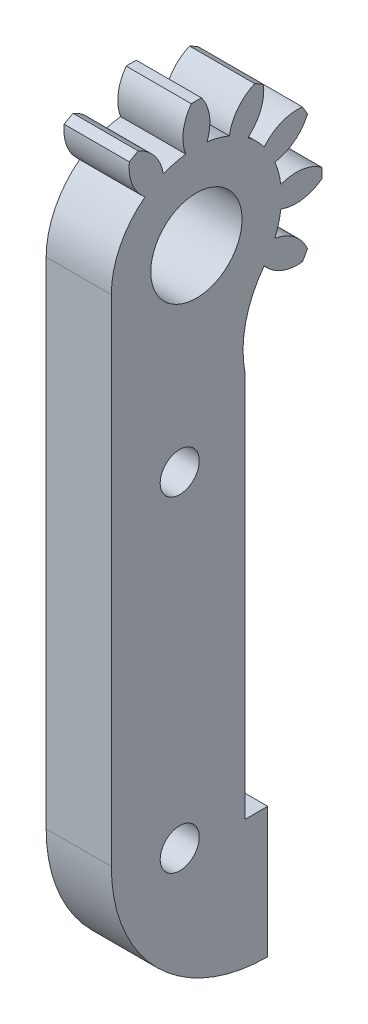
ISO-10303-21;
HEADER;
FILE_DESCRIPTION(('STEP AP214'),'2;1');
FILE_NAME('part.step','',(''),(''),'','','');
FILE_SCHEMA(('AUTOMOTIVE_DESIGN { 1 0 10303 214 1 1 1 1 }'));
ENDSEC;
DATA;
#1=APPLICATION_CONTEXT('core data for automotive mechanical design processes');
#2=APPLICATION_PROTOCOL_DEFINITION('international standard','automotive_design',2000,#1);
#3=PRODUCT_CONTEXT('',#1,'mechanical');
#4=PRODUCT('Part','Part','',(#3));
#5=PRODUCT_RELATED_PRODUCT_CATEGORY('part','',(#4));
#6=PRODUCT_DEFINITION_FORMATION('','',#4);
#7=PRODUCT_DEFINITION_CONTEXT('part definition',#1,'design');
#8=PRODUCT_DEFINITION('design','',#6,#7);
#9=PRODUCT_DEFINITION_SHAPE('','',#8);
#10=(LENGTH_UNIT() NAMED_UNIT(*) SI_UNIT(.MILLI.,.METRE.));
#11=(NAMED_UNIT(*) PLANE_ANGLE_UNIT() SI_UNIT($,.RADIAN.));
#12=(NAMED_UNIT(*) SI_UNIT($,.STERADIAN.) SOLID_ANGLE_UNIT());
#13=UNCERTAINTY_MEASURE_WITH_UNIT(LENGTH_MEASURE(1.E-05),#10,'distance_accuracy_value','');
#14=(GEOMETRIC_REPRESENTATION_CONTEXT(3) GLOBAL_UNCERTAINTY_ASSIGNED_CONTEXT((#13)) GLOBAL_UNIT_ASSIGNED_CONTEXT((#10,
#11,#12)) REPRESENTATION_CONTEXT('',''));
#15=CARTESIAN_POINT('',(0.,0.,0.));
#16=DIRECTION('',(0.,0.,1.));
#17=DIRECTION('',(1.,0.,0.));
#18=AXIS2_PLACEMENT_3D('',#15,#16,#17);
#19=CARTESIAN_POINT('',(5.,0.,0.));
#20=DIRECTION('',(-1.,0.,0.));
#21=DIRECTION('',(0.,-0.258819045102521,0.965925826289068));
#22=AXIS2_PLACEMENT_3D('',#19,#20,#21);
#23=CYLINDRICAL_SURFACE('',#22,6.53025);
#24=CARTESIAN_POINT('',(0.,0.,0.));
#25=DIRECTION('',(-1.,0.,0.));
#26=DIRECTION('',(0.,0.707106781186549,-0.707106781186546));
#27=AXIS2_PLACEMENT_3D('',#24,#25,#26);
#28=CIRCLE('',#27,6.53025);
#29=CARTESIAN_POINT('',(0.,0.,6.53025));
#30=VERTEX_POINT('',#29);
#31=CARTESIAN_POINT('',(0.,5.20307403430746,3.94616087558724));
#32=VERTEX_POINT('',#31);
#33=EDGE_CURVE('E251',#30,#32,#28,.T.);
#34=ORIENTED_EDGE('',*,*,#33,.F.);
#35=DIRECTION('',(1.,0.,0.));
#36=VECTOR('',#35,1.);
#37=CARTESIAN_POINT('',(-51.4198405287297,0.,6.53025));
#38=LINE('',#37,#36);
#39=CARTESIAN_POINT('',(5.,0.,6.53025));
#40=VERTEX_POINT('',#39);
#41=EDGE_CURVE('E236',#30,#40,#38,.T.);
#42=ORIENTED_EDGE('',*,*,#41,.T.);
#43=CARTESIAN_POINT('',(5.,0.,0.));
#44=DIRECTION('',(-1.,0.,0.));
#45=DIRECTION('',(0.,0.707106781186549,-0.707106781186546));
#46=AXIS2_PLACEMENT_3D('',#43,#44,#45);
#47=CIRCLE('',#46,6.53025);
#48=CARTESIAN_POINT('',(5.,5.20307403430746,3.94616087558724));
#49=VERTEX_POINT('',#48);
#50=EDGE_CURVE('E249',#40,#49,#47,.T.);
#51=ORIENTED_EDGE('',*,*,#50,.T.);
#52=DIRECTION('',(-1.,0.,0.));
#53=VECTOR('',#52,1.);
#54=CARTESIAN_POINT('',(5.,5.20307403430746,3.94616087558724));
#55=LINE('',#54,#53);
#56=EDGE_CURVE('E258',#49,#32,#55,.T.);
#57=ORIENTED_EDGE('',*,*,#56,.T.);
#58=EDGE_LOOP('',(#34,#42,#51,#57));
#59=FACE_BOUND('',#58,.T.);
#60=ADVANCED_FACE('F33',(#59),#23,.T.);
#61=CARTESIAN_POINT('',(5.,0.,0.));
#62=DIRECTION('',(-1.,0.,0.));
#63=DIRECTION('',(0.,-0.258819045102521,0.965925826289068));
#64=AXIS2_PLACEMENT_3D('',#61,#62,#63);
#65=PLANE('',#64);
#66=CARTESIAN_POINT('',(5.,-39.4107973671098,1.28024999999994));
#67=DIRECTION('',(-1.,0.,0.));
#68=DIRECTION('',(0.,0.,1.));
#69=AXIS2_PLACEMENT_3D('',#66,#67,#68);
#70=CIRCLE('',#69,1.50000000000004);
#71=CARTESIAN_POINT('',(5.,-39.4107973671098,2.78024999999999));
#72=VERTEX_POINT('',#71);
#73=EDGE_CURVE('E561',#72,#72,#70,.T.);
#74=ORIENTED_EDGE('',*,*,#73,.T.);
#75=EDGE_LOOP('',(#74));
#76=FACE_BOUND('',#75,.T.);
#77=CARTESIAN_POINT('',(5.,-14.4107973671098,1.28024999999996));
#78=DIRECTION('',(-1.,0.,0.));
#79=DIRECTION('',(0.,0.,1.));
#80=AXIS2_PLACEMENT_3D('',#77,#78,#79);
#81=CIRCLE('',#80,1.50000000000004);
#82=CARTESIAN_POINT('',(5.,-14.4107973671098,2.78025));
#83=VERTEX_POINT('',#82);
#84=EDGE_CURVE('E245',#83,#83,#81,.T.);
#85=ORIENTED_EDGE('',*,*,#84,.T.);
#86=EDGE_LOOP('',(#85));
#87=FACE_BOUND('',#86,.T.);
#88=ORIENTED_EDGE('',*,*,#50,.F.);
#89=DIRECTION('',(0.,-1.,0.));
#90=VECTOR('',#89,1.);
#91=CARTESIAN_POINT('',(5.,0.,6.53025));
#92=LINE('',#91,#90);
#93=CARTESIAN_POINT('',(5.,-38.,6.53024999999999));
#94=VERTEX_POINT('',#93);
#95=EDGE_CURVE('E232',#40,#94,#92,.T.);
#96=ORIENTED_EDGE('',*,*,#95,.T.);
#97=CARTESIAN_POINT('',(5.,-38.,-5.46975));
#98=DIRECTION('',(1.,0.,0.));
#99=DIRECTION('',(0.,0.,-1.));
#100=AXIS2_PLACEMENT_3D('',#97,#98,#99);
#101=CIRCLE('',#100,12.);
#102=CARTESIAN_POINT('',(5.,-50.,-5.46975000000001));
#103=VERTEX_POINT('',#102);
#104=EDGE_CURVE('E244',#94,#103,#101,.T.);
#105=ORIENTED_EDGE('',*,*,#104,.T.);
#106=DIRECTION('',(0.,1.,0.));
#107=VECTOR('',#106,1.);
#108=CARTESIAN_POINT('',(5.,-50.,-5.46975000000001));
#109=LINE('',#108,#107);
#110=CARTESIAN_POINT('',(5.,-40.,-5.46975));
#111=VERTEX_POINT('',#110);
#112=EDGE_CURVE('E578',#103,#111,#109,.T.);
#113=ORIENTED_EDGE('',*,*,#112,.T.);
#114=DIRECTION('',(0.,0.,1.));
#115=VECTOR('',#114,1.);
#116=CARTESIAN_POINT('',(5.,-40.,-5.46975));
#117=LINE('',#116,#115);
#118=CARTESIAN_POINT('',(5.,-40.,-3.71975000000001));
#119=VERTEX_POINT('',#118);
#120=EDGE_CURVE('E409',#111,#119,#117,.T.);
#121=ORIENTED_EDGE('',*,*,#120,.T.);
#122=DIRECTION('',(0.,1.,0.));
#123=VECTOR('',#122,1.);
#124=CARTESIAN_POINT('',(5.,-40.,-3.71975000000001));
#125=LINE('',#124,#123);
#126=CARTESIAN_POINT('',(5.,-10.2840002724986,-3.71975));
#127=VERTEX_POINT('',#126);
#128=EDGE_CURVE('E405',#119,#127,#125,.T.);
#129=ORIENTED_EDGE('',*,*,#128,.T.);
#130=CARTESIAN_POINT('',(5.,-8.78047610160418,-11.5771932907617));
#131=DIRECTION('',(-1.,0.,0.));
#132=DIRECTION('',(0.,0.,-1.));
#133=AXIS2_PLACEMENT_3D('',#130,#131,#132);
#134=CIRCLE('',#133,8.);
#135=CARTESIAN_POINT('',(5.,-3.94616087558718,-5.20307403430751));
#136=VERTEX_POINT('',#135);
#137=EDGE_CURVE('E252',#127,#136,#134,.T.);
#138=ORIENTED_EDGE('',*,*,#137,.T.);
#139=CARTESIAN_POINT('',(5.,-1.86722961459182,-7.76589373379014));
#140=DIRECTION('',(-1.,0.,0.));
#141=DIRECTION('',(0.,-0.707106781186554,0.707106781186541));
#142=AXIS2_PLACEMENT_3D('',#139,#140,#141);
#143=CIRCLE('',#142,3.3);
#144=CARTESIAN_POINT('',(5.,-5.14670283362097,-8.13339258504087));
#145=VERTEX_POINT('',#144);
#146=EDGE_CURVE('E384',#145,#136,#143,.T.);
#147=ORIENTED_EDGE('',*,*,#146,.F.);
#148=CARTESIAN_POINT('',(5.,0.,0.));
#149=DIRECTION('',(-1.,0.,0.));
#150=DIRECTION('',(0.,-0.258819045102521,0.965925826289068));
#151=AXIS2_PLACEMENT_3D('',#148,#149,#150);
#152=CIRCLE('',#151,9.625);
#153=CARTESIAN_POINT('',(5.,-4.47037318078674,-8.52387169216564));
#154=VERTEX_POINT('',#153);
#155=EDGE_CURVE('E400',#154,#145,#152,.T.);
#156=ORIENTED_EDGE('',*,*,#155,.F.);
#157=CARTESIAN_POINT('',(5.,-5.79184644925663,-5.50001514783032));
#158=DIRECTION('',(-1.,0.,0.));
#159=DIRECTION('',(0.,-0.965925826289071,0.258819045102511));
#160=AXIS2_PLACEMENT_3D('',#157,#158,#159);
#161=CIRCLE('',#160,3.3);
#162=CARTESIAN_POINT('',(5.,-2.53291385368778,-6.01901258283254));
#163=VERTEX_POINT('',#162);
#164=EDGE_CURVE('E363',#163,#154,#161,.T.);
#165=ORIENTED_EDGE('',*,*,#164,.F.);
#166=CARTESIAN_POINT('',(5.,0.,0.));
#167=DIRECTION('',(-1.,0.,0.));
#168=DIRECTION('',(0.,-0.965925826289071,0.258819045102511));
#169=AXIS2_PLACEMENT_3D('',#166,#167,#168);
#170=CIRCLE('',#169,6.53025);
#171=CARTESIAN_POINT('',(5.,-0.815938548524983,-6.47907472927508));
#172=VERTEX_POINT('',#171);
#173=EDGE_CURVE('E368',#172,#163,#170,.T.);
#174=ORIENTED_EDGE('',*,*,#173,.F.);
#175=CARTESIAN_POINT('',(5.,2.26587858595993,-7.65907606384855));
#176=DIRECTION('',(-1.,0.,0.));
#177=DIRECTION('',(0.,-0.965925826289071,0.258819045102511));
#178=AXIS2_PLACEMENT_3D('',#175,#176,#177);
#179=CIRCLE('',#178,3.3);
#180=CARTESIAN_POINT('',(5.,-0.390479107124668,-9.61707601440787));
#181=VERTEX_POINT('',#180);
#182=EDGE_CURVE('E365',#181,#172,#179,.T.);
#183=ORIENTED_EDGE('',*,*,#182,.F.);
#184=CARTESIAN_POINT('',(5.,0.390479107124869,-9.61707601440786));
#185=VERTEX_POINT('',#184);
#186=EDGE_CURVE('E485',#185,#181,#152,.T.);
#187=ORIENTED_EDGE('',*,*,#186,.F.);
#188=CARTESIAN_POINT('',(5.,-2.26587858595977,-7.6590760638486));
#189=DIRECTION('',(-1.,0.,0.));
#190=DIRECTION('',(0.,-0.965925826289065,-0.258819045102531));
#191=AXIS2_PLACEMENT_3D('',#188,#189,#190);
#192=CIRCLE('',#191,3.3);
#193=CARTESIAN_POINT('',(5.,0.81593854852512,-6.47907472927506));
#194=VERTEX_POINT('',#193);
#195=EDGE_CURVE('E341',#194,#185,#192,.T.);
#196=ORIENTED_EDGE('',*,*,#195,.F.);
#197=CARTESIAN_POINT('',(5.,0.,0.));
#198=DIRECTION('',(-1.,0.,0.));
#199=DIRECTION('',(0.,-0.965925826289065,-0.258819045102531));
#200=AXIS2_PLACEMENT_3D('',#197,#198,#199);
#201=CIRCLE('',#200,6.53025);
#202=CARTESIAN_POINT('',(5.,2.53291385368791,-6.01901258283249));
#203=VERTEX_POINT('',#202);
#204=EDGE_CURVE('E346',#203,#194,#201,.T.);
#205=ORIENTED_EDGE('',*,*,#204,.F.);
#206=CARTESIAN_POINT('',(5.,5.79184644925675,-5.5000151478302));
#207=DIRECTION('',(-1.,0.,0.));
#208=DIRECTION('',(0.,-0.965925826289065,-0.258819045102531));
#209=AXIS2_PLACEMENT_3D('',#206,#207,#208);
#210=CIRCLE('',#209,3.3);
#211=CARTESIAN_POINT('',(5.,4.47037318078691,-8.52387169216554));
#212=VERTEX_POINT('',#211);
#213=EDGE_CURVE('E343',#212,#203,#210,.T.);
#214=ORIENTED_EDGE('',*,*,#213,.F.);
#215=CARTESIAN_POINT('',(5.,5.14670283362114,-8.13339258504076));
#216=VERTEX_POINT('',#215);
#217=EDGE_CURVE('E487',#216,#212,#152,.T.);
#218=ORIENTED_EDGE('',*,*,#217,.F.);
#219=CARTESIAN_POINT('',(5.,1.86722961459199,-7.7658937337901));
#220=DIRECTION('',(-1.,0.,0.));
#221=DIRECTION('',(0.,-0.707106781186539,-0.707106781186556));
#222=AXIS2_PLACEMENT_3D('',#219,#220,#221);
#223=CIRCLE('',#222,3.3);
#224=CARTESIAN_POINT('',(5.,3.94616087558729,-5.20307403430742));
#225=VERTEX_POINT('',#224);
#226=EDGE_CURVE('E447',#225,#216,#223,.T.);
#227=ORIENTED_EDGE('',*,*,#226,.F.);
#228=CARTESIAN_POINT('',(5.,0.,0.));
#229=DIRECTION('',(-1.,0.,0.));
#230=DIRECTION('',(0.,-0.707106781186539,-0.707106781186556));
#231=AXIS2_PLACEMENT_3D('',#228,#229,#230);
#232=CIRCLE('',#231,6.53025);
#233=CARTESIAN_POINT('',(5.,5.20307403430752,-3.94616087558716));
#234=VERTEX_POINT('',#233);
#235=EDGE_CURVE('E452',#234,#225,#232,.T.);
#236=ORIENTED_EDGE('',*,*,#235,.F.);
#237=CARTESIAN_POINT('',(5.,7.76589373379014,-1.8672296145918));
#238=DIRECTION('',(-1.,0.,0.));
#239=DIRECTION('',(0.,-0.707106781186539,-0.707106781186556));
#240=AXIS2_PLACEMENT_3D('',#237,#238,#239);
#241=CIRCLE('',#240,3.3);
#242=CARTESIAN_POINT('',(5.,8.13339258504089,-5.14670283362094));
#243=VERTEX_POINT('',#242);
#244=EDGE_CURVE('E449',#243,#234,#241,.T.);
#245=ORIENTED_EDGE('',*,*,#244,.F.);
#246=CARTESIAN_POINT('',(5.,8.52387169216565,-4.47037318078671));
#247=VERTEX_POINT('',#246);
#248=EDGE_CURVE('E303',#247,#243,#152,.T.);
#249=ORIENTED_EDGE('',*,*,#248,.F.);
#250=CARTESIAN_POINT('',(5.,5.50001514783034,-5.79184644925661));
#251=DIRECTION('',(-1.,0.,0.));
#252=DIRECTION('',(0.,-0.258819045102508,-0.965925826289072));
#253=AXIS2_PLACEMENT_3D('',#250,#251,#252);
#254=CIRCLE('',#253,3.3);
#255=CARTESIAN_POINT('',(5.,6.01901258283255,-2.53291385368776));
#256=VERTEX_POINT('',#255);
#257=EDGE_CURVE('E429',#256,#247,#254,.T.);
#258=ORIENTED_EDGE('',*,*,#257,.F.);
#259=CARTESIAN_POINT('',(5.,0.,0.));
#260=DIRECTION('',(-1.,0.,0.));
#261=DIRECTION('',(0.,-0.258819045102508,-0.965925826289072));
#262=AXIS2_PLACEMENT_3D('',#259,#260,#261);
#263=CIRCLE('',#262,6.53025);
#264=CARTESIAN_POINT('',(5.,6.47907472927508,-0.81593854852496));
#265=VERTEX_POINT('',#264);
#266=EDGE_CURVE('E434',#265,#256,#263,.T.);
#267=ORIENTED_EDGE('',*,*,#266,.F.);
#268=CARTESIAN_POINT('',(5.,7.65907606384855,2.26587858595996));
#269=DIRECTION('',(-1.,0.,0.));
#270=DIRECTION('',(0.,-0.258819045102508,-0.965925826289072));
#271=AXIS2_PLACEMENT_3D('',#268,#269,#270);
#272=CIRCLE('',#271,3.3);
#273=CARTESIAN_POINT('',(5.,9.61707601440787,-0.390479107124634));
#274=VERTEX_POINT('',#273);
#275=EDGE_CURVE('E431',#274,#265,#272,.T.);
#276=ORIENTED_EDGE('',*,*,#275,.F.);
#277=CARTESIAN_POINT('',(5.,9.61707601440786,0.390479107124769));
#278=VERTEX_POINT('',#277);
#279=EDGE_CURVE('E299',#278,#274,#152,.T.);
#280=ORIENTED_EDGE('',*,*,#279,.F.);
#281=CARTESIAN_POINT('',(5.,7.65907606384858,-2.26587858595985));
#282=DIRECTION('',(-1.,0.,0.));
#283=DIRECTION('',(0.,0.258819045102521,-0.965925826289068));
#284=AXIS2_PLACEMENT_3D('',#281,#282,#283);
#285=CIRCLE('',#284,3.3);
#286=CARTESIAN_POINT('',(5.,6.47907472927507,0.815938548525052));
#287=VERTEX_POINT('',#286);
#288=EDGE_CURVE('E272',#287,#278,#285,.T.);
#289=ORIENTED_EDGE('',*,*,#288,.F.);
#290=CARTESIAN_POINT('',(5.,0.,0.));
#291=DIRECTION('',(-1.,0.,0.));
#292=DIRECTION('',(0.,0.258819045102521,-0.965925826289068));
#293=AXIS2_PLACEMENT_3D('',#290,#291,#292);
#294=CIRCLE('',#293,6.53025);
#295=CARTESIAN_POINT('',(5.,6.01901258283252,2.53291385368785));
#296=VERTEX_POINT('',#295);
#297=EDGE_CURVE('E277',#296,#287,#294,.T.);
#298=ORIENTED_EDGE('',*,*,#297,.F.);
#299=CARTESIAN_POINT('',(5.,5.50001514783026,5.79184644925669));
#300=DIRECTION('',(-1.,0.,0.));
#301=DIRECTION('',(0.,0.258819045102521,-0.965925826289068));
#302=AXIS2_PLACEMENT_3D('',#299,#300,#301);
#303=CIRCLE('',#302,3.3);
#304=CARTESIAN_POINT('',(5.,8.52387169216559,4.47037318078683));
#305=VERTEX_POINT('',#304);
#306=EDGE_CURVE('E274',#305,#296,#303,.T.);
#307=ORIENTED_EDGE('',*,*,#306,.F.);
#308=CARTESIAN_POINT('',(5.,8.13339258504082,5.14670283362106));
#309=VERTEX_POINT('',#308);
#310=EDGE_CURVE('E297',#309,#305,#152,.T.);
#311=ORIENTED_EDGE('',*,*,#310,.F.);
#312=CARTESIAN_POINT('',(5.,7.76589373379012,1.86722961459191));
#313=DIRECTION('',(-1.,0.,0.));
#314=DIRECTION('',(0.,0.707106781186549,-0.707106781186546));
#315=AXIS2_PLACEMENT_3D('',#312,#313,#314);
#316=CIRCLE('',#315,3.3);
#317=EDGE_CURVE('E257',#49,#309,#316,.T.);
#318=ORIENTED_EDGE('',*,*,#317,.F.);
#319=EDGE_LOOP('',(#88,#96,#105,#113,#121,#129,#138,#147,#156,#165,#174,#183,#187,#196,#205,
#214,#218,#227,#236,#245,#249,#258,#267,#276,#280,#289,#298,#307,#311,#318));
#320=FACE_BOUND('',#319,.T.);
#321=CARTESIAN_POINT('',(5.,0.,0.));
#322=DIRECTION('',(-1.,0.,0.));
#323=DIRECTION('',(0.,-0.258819045102521,0.965925826289068));
#324=AXIS2_PLACEMENT_3D('',#321,#322,#323);
#325=CIRCLE('',#324,3.5);
#326=CARTESIAN_POINT('',(5.,-0.905866657858825,3.38074039201174));
#327=VERTEX_POINT('',#326);
#328=EDGE_CURVE('E426',#327,#327,#325,.F.);
#329=ORIENTED_EDGE('',*,*,#328,.F.);
#330=EDGE_LOOP('',(#329));
#331=FACE_BOUND('',#330,.T.);
#332=ADVANCED_FACE('F35',(#76,#87,#320,#331),#65,.F.);
#333=CARTESIAN_POINT('',(0.,0.,0.));
#334=DIRECTION('',(1.,0.,0.));
#335=DIRECTION('',(0.,0.258819045102521,-0.965925826289068));
#336=AXIS2_PLACEMENT_3D('',#333,#334,#335);
#337=PLANE('',#336);
#338=CARTESIAN_POINT('',(0.,-39.4107973671098,1.28024999999994));
#339=DIRECTION('',(-1.,0.,0.));
#340=DIRECTION('',(0.,0.,1.));
#341=AXIS2_PLACEMENT_3D('',#338,#339,#340);
#342=CIRCLE('',#341,1.50000000000004);
#343=CARTESIAN_POINT('',(0.,-39.4107973671098,2.78024999999999));
#344=VERTEX_POINT('',#343);
#345=EDGE_CURVE('E556',#344,#344,#342,.T.);
#346=ORIENTED_EDGE('',*,*,#345,.F.);
#347=EDGE_LOOP('',(#346));
#348=FACE_BOUND('',#347,.T.);
#349=CARTESIAN_POINT('',(0.,-14.4107973671098,1.28024999999996));
#350=DIRECTION('',(-1.,0.,0.));
#351=DIRECTION('',(0.,0.,1.));
#352=AXIS2_PLACEMENT_3D('',#349,#350,#351);
#353=CIRCLE('',#352,1.50000000000004);
#354=CARTESIAN_POINT('',(0.,-14.4107973671098,2.78025));
#355=VERTEX_POINT('',#354);
#356=EDGE_CURVE('E559',#355,#355,#353,.T.);
#357=ORIENTED_EDGE('',*,*,#356,.F.);
#358=EDGE_LOOP('',(#357));
#359=FACE_BOUND('',#358,.T.);
#360=CARTESIAN_POINT('',(0.,-1.86722961459182,-7.76589373379014));
#361=DIRECTION('',(1.,0.,0.));
#362=DIRECTION('',(0.,0.258819045102521,-0.965925826289068));
#363=AXIS2_PLACEMENT_3D('',#360,#361,#362);
#364=CIRCLE('',#363,3.3);
#365=CARTESIAN_POINT('',(0.,-3.94616087558718,-5.20307403430751));
#366=VERTEX_POINT('',#365);
#367=CARTESIAN_POINT('',(0.,-5.14670283362097,-8.13339258504087));
#368=VERTEX_POINT('',#367);
#369=EDGE_CURVE('E306',#366,#368,#364,.T.);
#370=ORIENTED_EDGE('',*,*,#369,.F.);
#371=CARTESIAN_POINT('',(0.,-8.78047610160418,-11.5771932907617));
#372=DIRECTION('',(1.,0.,0.));
#373=DIRECTION('',(0.,0.,-1.));
#374=AXIS2_PLACEMENT_3D('',#371,#372,#373);
#375=CIRCLE('',#374,8.);
#376=CARTESIAN_POINT('',(0.,-10.2840002724986,-3.71975));
#377=VERTEX_POINT('',#376);
#378=EDGE_CURVE('E425',#366,#377,#375,.T.);
#379=ORIENTED_EDGE('',*,*,#378,.T.);
#380=DIRECTION('',(0.,-1.,0.));
#381=VECTOR('',#380,1.);
#382=CARTESIAN_POINT('',(0.,-40.,-3.71975000000001));
#383=LINE('',#382,#381);
#384=CARTESIAN_POINT('',(0.,-40.,-3.71975000000001));
#385=VERTEX_POINT('',#384);
#386=EDGE_CURVE('E574',#377,#385,#383,.T.);
#387=ORIENTED_EDGE('',*,*,#386,.T.);
#388=DIRECTION('',(0.,0.,-1.));
#389=VECTOR('',#388,1.);
#390=CARTESIAN_POINT('',(0.,-40.,-5.46975));
#391=LINE('',#390,#389);
#392=CARTESIAN_POINT('',(0.,-40.,-5.46975));
#393=VERTEX_POINT('',#392);
#394=EDGE_CURVE('E572',#385,#393,#391,.T.);
#395=ORIENTED_EDGE('',*,*,#394,.T.);
#396=DIRECTION('',(0.,-1.,0.));
#397=VECTOR('',#396,1.);
#398=CARTESIAN_POINT('',(0.,-50.,-5.46975000000001));
#399=LINE('',#398,#397);
#400=CARTESIAN_POINT('',(0.,-50.,-5.46975000000001));
#401=VERTEX_POINT('',#400);
#402=EDGE_CURVE('E570',#393,#401,#399,.T.);
#403=ORIENTED_EDGE('',*,*,#402,.T.);
#404=CARTESIAN_POINT('',(0.,-38.,-5.46975));
#405=DIRECTION('',(1.,0.,0.));
#406=DIRECTION('',(0.,0.,-1.));
#407=AXIS2_PLACEMENT_3D('',#404,#405,#406);
#408=CIRCLE('',#407,12.);
#409=CARTESIAN_POINT('',(0.,-38.,6.53024999999999));
#410=VERTEX_POINT('',#409);
#411=EDGE_CURVE('E415',#401,#410,#408,.F.);
#412=ORIENTED_EDGE('',*,*,#411,.T.);
#413=DIRECTION('',(0.,1.,0.));
#414=VECTOR('',#413,1.);
#415=CARTESIAN_POINT('',(0.,0.,6.53025));
#416=LINE('',#415,#414);
#417=EDGE_CURVE('E423',#410,#30,#416,.T.);
#418=ORIENTED_EDGE('',*,*,#417,.T.);
#419=ORIENTED_EDGE('',*,*,#33,.T.);
#420=CARTESIAN_POINT('',(0.,7.76589373379012,1.86722961459191));
#421=DIRECTION('',(-1.,0.,0.));
#422=DIRECTION('',(0.,0.707106781186549,-0.707106781186546));
#423=AXIS2_PLACEMENT_3D('',#420,#421,#422);
#424=CIRCLE('',#423,3.3);
#425=CARTESIAN_POINT('',(0.,8.13339258504082,5.14670283362106));
#426=VERTEX_POINT('',#425);
#427=EDGE_CURVE('E265',#32,#426,#424,.T.);
#428=ORIENTED_EDGE('',*,*,#427,.T.);
#429=CARTESIAN_POINT('',(0.,0.,0.));
#430=DIRECTION('',(-1.,0.,0.));
#431=DIRECTION('',(0.,-0.258819045102521,0.965925826289068));
#432=AXIS2_PLACEMENT_3D('',#429,#430,#431);
#433=CIRCLE('',#432,9.625);
#434=CARTESIAN_POINT('',(0.,8.52387169216559,4.47037318078683));
#435=VERTEX_POINT('',#434);
#436=EDGE_CURVE('E293',#426,#435,#433,.T.);
#437=ORIENTED_EDGE('',*,*,#436,.T.);
#438=CARTESIAN_POINT('',(0.,5.50001514783026,5.79184644925669));
#439=DIRECTION('',(1.,0.,0.));
#440=DIRECTION('',(0.,0.258819045102521,-0.965925826289068));
#441=AXIS2_PLACEMENT_3D('',#438,#439,#440);
#442=CIRCLE('',#441,3.3);
#443=CARTESIAN_POINT('',(0.,6.01901258283252,2.53291385368785));
#444=VERTEX_POINT('',#443);
#445=EDGE_CURVE('E302',#444,#435,#442,.T.);
#446=ORIENTED_EDGE('',*,*,#445,.F.);
#447=CARTESIAN_POINT('',(0.,0.,0.));
#448=DIRECTION('',(-1.,0.,0.));
#449=DIRECTION('',(0.,0.258819045102521,-0.965925826289068));
#450=AXIS2_PLACEMENT_3D('',#447,#448,#449);
#451=CIRCLE('',#450,6.53025);
#452=CARTESIAN_POINT('',(0.,6.47907472927507,0.815938548525052));
#453=VERTEX_POINT('',#452);
#454=EDGE_CURVE('E275',#444,#453,#451,.T.);
#455=ORIENTED_EDGE('',*,*,#454,.T.);
#456=CARTESIAN_POINT('',(0.,7.65907606384858,-2.26587858595985));
#457=DIRECTION('',(-1.,0.,0.));
#458=DIRECTION('',(0.,0.258819045102521,-0.965925826289068));
#459=AXIS2_PLACEMENT_3D('',#456,#457,#458);
#460=CIRCLE('',#459,3.3);
#461=CARTESIAN_POINT('',(0.,9.61707601440786,0.390479107124768));
#462=VERTEX_POINT('',#461);
#463=EDGE_CURVE('E271',#453,#462,#460,.T.);
#464=ORIENTED_EDGE('',*,*,#463,.T.);
#465=CARTESIAN_POINT('',(0.,9.61707601440787,-0.390479107124634));
#466=VERTEX_POINT('',#465);
#467=EDGE_CURVE('E294',#462,#466,#433,.T.);
#468=ORIENTED_EDGE('',*,*,#467,.T.);
#469=CARTESIAN_POINT('',(0.,7.65907606384855,2.26587858595996));
#470=DIRECTION('',(1.,0.,0.));
#471=DIRECTION('',(0.,0.258819045102521,-0.965925826289068));
#472=AXIS2_PLACEMENT_3D('',#469,#470,#471);
#473=CIRCLE('',#472,3.3);
#474=CARTESIAN_POINT('',(0.,6.47907472927508,-0.81593854852496));
#475=VERTEX_POINT('',#474);
#476=EDGE_CURVE('E11',#475,#466,#473,.T.);
#477=ORIENTED_EDGE('',*,*,#476,.F.);
#478=CARTESIAN_POINT('',(0.,0.,0.));
#479=DIRECTION('',(-1.,0.,0.));
#480=DIRECTION('',(0.,-0.258819045102508,-0.965925826289072));
#481=AXIS2_PLACEMENT_3D('',#478,#479,#480);
#482=CIRCLE('',#481,6.53025);
#483=CARTESIAN_POINT('',(0.,6.01901258283255,-2.53291385368776));
#484=VERTEX_POINT('',#483);
#485=EDGE_CURVE('E432',#475,#484,#482,.T.);
#486=ORIENTED_EDGE('',*,*,#485,.T.);
#487=CARTESIAN_POINT('',(0.,5.50001514783034,-5.79184644925661));
#488=DIRECTION('',(-1.,0.,0.));
#489=DIRECTION('',(0.,-0.258819045102508,-0.965925826289072));
#490=AXIS2_PLACEMENT_3D('',#487,#488,#489);
#491=CIRCLE('',#490,3.3);
#492=CARTESIAN_POINT('',(0.,8.52387169216565,-4.47037318078671));
#493=VERTEX_POINT('',#492);
#494=EDGE_CURVE('E49',#484,#493,#491,.T.);
#495=ORIENTED_EDGE('',*,*,#494,.T.);
#496=CARTESIAN_POINT('',(0.,8.13339258504089,-5.14670283362094));
#497=VERTEX_POINT('',#496);
#498=EDGE_CURVE('E298',#493,#497,#433,.T.);
#499=ORIENTED_EDGE('',*,*,#498,.T.);
#500=CARTESIAN_POINT('',(0.,7.76589373379014,-1.8672296145918));
#501=DIRECTION('',(1.,0.,0.));
#502=DIRECTION('',(0.,0.258819045102521,-0.965925826289068));
#503=AXIS2_PLACEMENT_3D('',#500,#501,#502);
#504=CIRCLE('',#503,3.3);
#505=CARTESIAN_POINT('',(0.,5.20307403430752,-3.94616087558716));
#506=VERTEX_POINT('',#505);
#507=EDGE_CURVE('E42',#506,#497,#504,.T.);
#508=ORIENTED_EDGE('',*,*,#507,.F.);
#509=CARTESIAN_POINT('',(0.,0.,0.));
#510=DIRECTION('',(-1.,0.,0.));
#511=DIRECTION('',(0.,-0.707106781186539,-0.707106781186556));
#512=AXIS2_PLACEMENT_3D('',#509,#510,#511);
#513=CIRCLE('',#512,6.53025);
#514=CARTESIAN_POINT('',(0.,3.94616087558729,-5.20307403430742));
#515=VERTEX_POINT('',#514);
#516=EDGE_CURVE('E450',#506,#515,#513,.T.);
#517=ORIENTED_EDGE('',*,*,#516,.T.);
#518=CARTESIAN_POINT('',(0.,1.86722961459199,-7.7658937337901));
#519=DIRECTION('',(-1.,0.,0.));
#520=DIRECTION('',(0.,-0.707106781186539,-0.707106781186556));
#521=AXIS2_PLACEMENT_3D('',#518,#519,#520);
#522=CIRCLE('',#521,3.3);
#523=CARTESIAN_POINT('',(0.,5.14670283362114,-8.13339258504076));
#524=VERTEX_POINT('',#523);
#525=EDGE_CURVE('E57',#515,#524,#522,.T.);
#526=ORIENTED_EDGE('',*,*,#525,.T.);
#527=CARTESIAN_POINT('',(0.,4.47037318078691,-8.52387169216554));
#528=VERTEX_POINT('',#527);
#529=EDGE_CURVE('E463',#524,#528,#433,.T.);
#530=ORIENTED_EDGE('',*,*,#529,.T.);
#531=CARTESIAN_POINT('',(0.,5.79184644925675,-5.5000151478302));
#532=DIRECTION('',(1.,0.,0.));
#533=DIRECTION('',(0.,0.258819045102521,-0.965925826289068));
#534=AXIS2_PLACEMENT_3D('',#531,#532,#533);
#535=CIRCLE('',#534,3.3);
#536=CARTESIAN_POINT('',(0.,2.53291385368791,-6.01901258283249));
#537=VERTEX_POINT('',#536);
#538=EDGE_CURVE('E312',#537,#528,#535,.T.);
#539=ORIENTED_EDGE('',*,*,#538,.F.);
#540=CARTESIAN_POINT('',(0.,0.,0.));
#541=DIRECTION('',(-1.,0.,0.));
#542=DIRECTION('',(0.,-0.965925826289065,-0.258819045102531));
#543=AXIS2_PLACEMENT_3D('',#540,#541,#542);
#544=CIRCLE('',#543,6.53025);
#545=CARTESIAN_POINT('',(0.,0.81593854852512,-6.47907472927506));
#546=VERTEX_POINT('',#545);
#547=EDGE_CURVE('E344',#537,#546,#544,.T.);
#548=ORIENTED_EDGE('',*,*,#547,.T.);
#549=CARTESIAN_POINT('',(0.,-2.26587858595977,-7.6590760638486));
#550=DIRECTION('',(-1.,0.,0.));
#551=DIRECTION('',(0.,-0.965925826289065,-0.258819045102531));
#552=AXIS2_PLACEMENT_3D('',#549,#550,#551);
#553=CIRCLE('',#552,3.3);
#554=CARTESIAN_POINT('',(0.,0.390479107124869,-9.61707601440786));
#555=VERTEX_POINT('',#554);
#556=EDGE_CURVE('E335',#546,#555,#553,.T.);
#557=ORIENTED_EDGE('',*,*,#556,.T.);
#558=CARTESIAN_POINT('',(0.,-0.390479107124668,-9.61707601440787));
#559=VERTEX_POINT('',#558);
#560=EDGE_CURVE('E469',#555,#559,#433,.T.);
#561=ORIENTED_EDGE('',*,*,#560,.T.);
#562=CARTESIAN_POINT('',(0.,2.26587858595993,-7.65907606384855));
#563=DIRECTION('',(1.,0.,0.));
#564=DIRECTION('',(0.,0.258819045102521,-0.965925826289068));
#565=AXIS2_PLACEMENT_3D('',#562,#563,#564);
#566=CIRCLE('',#565,3.3);
#567=CARTESIAN_POINT('',(0.,-0.815938548524983,-6.47907472927508));
#568=VERTEX_POINT('',#567);
#569=EDGE_CURVE('E309',#568,#559,#566,.T.);
#570=ORIENTED_EDGE('',*,*,#569,.F.);
#571=CARTESIAN_POINT('',(0.,0.,0.));
#572=DIRECTION('',(-1.,0.,0.));
#573=DIRECTION('',(0.,-0.965925826289071,0.258819045102511));
#574=AXIS2_PLACEMENT_3D('',#571,#572,#573);
#575=CIRCLE('',#574,6.53025);
#576=CARTESIAN_POINT('',(0.,-2.53291385368778,-6.01901258283254));
#577=VERTEX_POINT('',#576);
#578=EDGE_CURVE('E366',#568,#577,#575,.T.);
#579=ORIENTED_EDGE('',*,*,#578,.T.);
#580=CARTESIAN_POINT('',(0.,-5.79184644925663,-5.50001514783032));
#581=DIRECTION('',(-1.,0.,0.));
#582=DIRECTION('',(0.,-0.965925826289071,0.258819045102511));
#583=AXIS2_PLACEMENT_3D('',#580,#581,#582);
#584=CIRCLE('',#583,3.3);
#585=CARTESIAN_POINT('',(0.,-4.47037318078674,-8.52387169216564));
#586=VERTEX_POINT('',#585);
#587=EDGE_CURVE('E362',#577,#586,#584,.T.);
#588=ORIENTED_EDGE('',*,*,#587,.T.);
#589=EDGE_CURVE('E470',#586,#368,#433,.T.);
#590=ORIENTED_EDGE('',*,*,#589,.T.);
#591=EDGE_LOOP('',(#370,#379,#387,#395,#403,#412,#418,#419,#428,#437,#446,#455,#464,#468,#477,
#486,#495,#499,#508,#517,#526,#530,#539,#548,#557,#561,#570,#579,#588,#590));
#592=FACE_BOUND('',#591,.T.);
#593=CARTESIAN_POINT('',(0.,0.,0.));
#594=DIRECTION('',(1.,0.,0.));
#595=DIRECTION('',(0.,0.258819045102521,-0.965925826289068));
#596=AXIS2_PLACEMENT_3D('',#593,#594,#595);
#597=CIRCLE('',#596,3.5);
#598=CARTESIAN_POINT('',(0.,0.905866657858825,-3.38074039201174));
#599=VERTEX_POINT('',#598);
#600=EDGE_CURVE('E37',#599,#599,#597,.F.);
#601=ORIENTED_EDGE('',*,*,#600,.F.);
#602=EDGE_LOOP('',(#601));
#603=FACE_BOUND('',#602,.T.);
#604=ADVANCED_FACE('F459',(#348,#359,#592,#603),#337,.F.);
#605=CARTESIAN_POINT('',(-10.,0.,0.));
#606=DIRECTION('',(-1.,0.,0.));
#607=DIRECTION('',(0.,-0.258819045102521,0.965925826289068));
#608=AXIS2_PLACEMENT_3D('',#605,#606,#607);
#609=CYLINDRICAL_SURFACE('',#608,9.625);
#610=DIRECTION('',(-1.,0.,0.));
#611=VECTOR('',#610,1.);
#612=CARTESIAN_POINT('',(2.5,8.52387169216565,-4.47037318078671));
#613=LINE('',#612,#611);
#614=EDGE_CURVE('E445',#247,#493,#613,.T.);
#615=ORIENTED_EDGE('',*,*,#614,.F.);
#616=ORIENTED_EDGE('',*,*,#248,.T.);
#617=DIRECTION('',(-1.,0.,0.));
#618=VECTOR('',#617,1.);
#619=CARTESIAN_POINT('',(2.5,8.13339258504089,-5.14670283362094));
#620=LINE('',#619,#618);
#621=EDGE_CURVE('E321',#497,#243,#620,.F.);
#622=ORIENTED_EDGE('',*,*,#621,.F.);
#623=ORIENTED_EDGE('',*,*,#498,.F.);
#624=EDGE_LOOP('',(#615,#616,#622,#623));
#625=FACE_BOUND('',#624,.T.);
#626=ADVANCED_FACE('F331',(#625),#609,.T.);
#627=DIRECTION('',(-1.,0.,0.));
#628=VECTOR('',#627,1.);
#629=CARTESIAN_POINT('',(2.5,9.61707601440787,-0.390479107124633));
#630=LINE('',#629,#628);
#631=EDGE_CURVE('E443',#466,#274,#630,.F.);
#632=ORIENTED_EDGE('',*,*,#631,.F.);
#633=ORIENTED_EDGE('',*,*,#467,.F.);
#634=DIRECTION('',(-1.,0.,0.));
#635=VECTOR('',#634,1.);
#636=CARTESIAN_POINT('',(2.5,9.61707601440786,0.390479107124768));
#637=LINE('',#636,#635);
#638=EDGE_CURVE('E291',#278,#462,#637,.T.);
#639=ORIENTED_EDGE('',*,*,#638,.F.);
#640=ORIENTED_EDGE('',*,*,#279,.T.);
#641=EDGE_LOOP('',(#632,#633,#639,#640));
#642=FACE_BOUND('',#641,.T.);
#643=ADVANCED_FACE('F552',(#642),#609,.T.);
#644=DIRECTION('',(-1.,0.,0.));
#645=VECTOR('',#644,1.);
#646=CARTESIAN_POINT('',(2.5,5.14670283362114,-8.13339258504076));
#647=LINE('',#646,#645);
#648=EDGE_CURVE('E333',#216,#524,#647,.T.);
#649=ORIENTED_EDGE('',*,*,#648,.F.);
#650=ORIENTED_EDGE('',*,*,#217,.T.);
#651=DIRECTION('',(-1.,0.,0.));
#652=VECTOR('',#651,1.);
#653=CARTESIAN_POINT('',(2.5,4.47037318078691,-8.52387169216554));
#654=LINE('',#653,#652);
#655=EDGE_CURVE('E357',#528,#212,#654,.F.);
#656=ORIENTED_EDGE('',*,*,#655,.F.);
#657=ORIENTED_EDGE('',*,*,#529,.F.);
#658=EDGE_LOOP('',(#649,#650,#656,#657));
#659=FACE_BOUND('',#658,.T.);
#660=ADVANCED_FACE('F467',(#659),#609,.T.);
#661=DIRECTION('',(-1.,0.,0.));
#662=VECTOR('',#661,1.);
#663=CARTESIAN_POINT('',(2.5,0.390479107124869,-9.61707601440786));
#664=LINE('',#663,#662);
#665=EDGE_CURVE('E360',#185,#555,#664,.T.);
#666=ORIENTED_EDGE('',*,*,#665,.F.);
#667=ORIENTED_EDGE('',*,*,#186,.T.);
#668=DIRECTION('',(-1.,0.,0.));
#669=VECTOR('',#668,1.);
#670=CARTESIAN_POINT('',(2.5,-0.390479107124667,-9.61707601440787));
#671=LINE('',#670,#669);
#672=EDGE_CURVE('E379',#559,#181,#671,.F.);
#673=ORIENTED_EDGE('',*,*,#672,.F.);
#674=ORIENTED_EDGE('',*,*,#560,.F.);
#675=EDGE_LOOP('',(#666,#667,#673,#674));
#676=FACE_BOUND('',#675,.T.);
#677=ADVANCED_FACE('F504',(#676),#609,.T.);
#678=DIRECTION('',(-1.,0.,0.));
#679=VECTOR('',#678,1.);
#680=CARTESIAN_POINT('',(2.5,-4.47037318078674,-8.52387169216564));
#681=LINE('',#680,#679);
#682=EDGE_CURVE('E382',#154,#586,#681,.T.);
#683=ORIENTED_EDGE('',*,*,#682,.F.);
#684=ORIENTED_EDGE('',*,*,#155,.T.);
#685=DIRECTION('',(-1.,0.,0.));
#686=VECTOR('',#685,1.);
#687=CARTESIAN_POINT('',(2.5,-5.14670283362097,-8.13339258504087));
#688=LINE('',#687,#686);
#689=EDGE_CURVE('E268',#368,#145,#688,.F.);
#690=ORIENTED_EDGE('',*,*,#689,.F.);
#691=ORIENTED_EDGE('',*,*,#589,.F.);
#692=EDGE_LOOP('',(#683,#684,#690,#691));
#693=FACE_BOUND('',#692,.T.);
#694=ADVANCED_FACE('F516',(#693),#609,.T.);
#695=DIRECTION('',(-1.,0.,0.));
#696=VECTOR('',#695,1.);
#697=CARTESIAN_POINT('',(2.5,8.13339258504082,5.14670283362106));
#698=LINE('',#697,#696);
#699=EDGE_CURVE('E260',#309,#426,#698,.T.);
#700=ORIENTED_EDGE('',*,*,#699,.F.);
#701=ORIENTED_EDGE('',*,*,#310,.T.);
#702=DIRECTION('',(-1.,0.,0.));
#703=VECTOR('',#702,1.);
#704=CARTESIAN_POINT('',(2.5,8.52387169216559,4.47037318078683));
#705=LINE('',#704,#703);
#706=EDGE_CURVE('E288',#435,#305,#705,.F.);
#707=ORIENTED_EDGE('',*,*,#706,.F.);
#708=ORIENTED_EDGE('',*,*,#436,.F.);
#709=EDGE_LOOP('',(#700,#701,#707,#708));
#710=FACE_BOUND('',#709,.T.);
#711=ADVANCED_FACE('F484',(#710),#609,.T.);
#712=CARTESIAN_POINT('',(5.,7.65907606384858,-2.26587858595985));
#713=DIRECTION('',(-1.,0.,0.));
#714=DIRECTION('',(0.,-0.258819045102521,0.965925826289068));
#715=AXIS2_PLACEMENT_3D('',#712,#713,#714);
#716=CYLINDRICAL_SURFACE('',#715,3.3);
#717=ORIENTED_EDGE('',*,*,#638,.T.);
#718=ORIENTED_EDGE('',*,*,#463,.F.);
#719=DIRECTION('',(-1.,0.,0.));
#720=VECTOR('',#719,1.);
#721=CARTESIAN_POINT('',(5.,6.47907472927507,0.815938548525052));
#722=LINE('',#721,#720);
#723=EDGE_CURVE('E279',#287,#453,#722,.T.);
#724=ORIENTED_EDGE('',*,*,#723,.F.);
#725=ORIENTED_EDGE('',*,*,#288,.T.);
#726=EDGE_LOOP('',(#717,#718,#724,#725));
#727=FACE_BOUND('',#726,.T.);
#728=ADVANCED_FACE('F522',(#727),#716,.T.);
#729=CARTESIAN_POINT('',(5.,5.50001514783026,5.79184644925669));
#730=DIRECTION('',(-1.,0.,0.));
#731=DIRECTION('',(0.,-0.258819045102521,0.965925826289068));
#732=AXIS2_PLACEMENT_3D('',#729,#730,#731);
#733=CYLINDRICAL_SURFACE('',#732,3.3);
#734=ORIENTED_EDGE('',*,*,#706,.T.);
#735=ORIENTED_EDGE('',*,*,#306,.T.);
#736=DIRECTION('',(-1.,0.,0.));
#737=VECTOR('',#736,1.);
#738=CARTESIAN_POINT('',(5.,6.01901258283252,2.53291385368785));
#739=LINE('',#738,#737);
#740=EDGE_CURVE('E286',#296,#444,#739,.T.);
#741=ORIENTED_EDGE('',*,*,#740,.T.);
#742=ORIENTED_EDGE('',*,*,#445,.T.);
#743=EDGE_LOOP('',(#734,#735,#741,#742));
#744=FACE_BOUND('',#743,.T.);
#745=ADVANCED_FACE('F480',(#744),#733,.T.);
#746=CARTESIAN_POINT('',(5.,0.,0.));
#747=DIRECTION('',(-1.,0.,0.));
#748=DIRECTION('',(0.,-0.258819045102521,0.965925826289068));
#749=AXIS2_PLACEMENT_3D('',#746,#747,#748);
#750=CYLINDRICAL_SURFACE('',#749,6.53025);
#751=ORIENTED_EDGE('',*,*,#454,.F.);
#752=ORIENTED_EDGE('',*,*,#740,.F.);
#753=ORIENTED_EDGE('',*,*,#297,.T.);
#754=ORIENTED_EDGE('',*,*,#723,.T.);
#755=EDGE_LOOP('',(#751,#752,#753,#754));
#756=FACE_BOUND('',#755,.T.);
#757=ADVANCED_FACE('F537',(#756),#750,.T.);
#758=CARTESIAN_POINT('',(5.,7.76589373379012,1.86722961459191));
#759=DIRECTION('',(-1.,0.,0.));
#760=DIRECTION('',(0.,-0.258819045102521,0.965925826289068));
#761=AXIS2_PLACEMENT_3D('',#758,#759,#760);
#762=CYLINDRICAL_SURFACE('',#761,3.3);
#763=ORIENTED_EDGE('',*,*,#699,.T.);
#764=ORIENTED_EDGE('',*,*,#427,.F.);
#765=ORIENTED_EDGE('',*,*,#56,.F.);
#766=ORIENTED_EDGE('',*,*,#317,.T.);
#767=EDGE_LOOP('',(#763,#764,#765,#766));
#768=FACE_BOUND('',#767,.T.);
#769=ADVANCED_FACE('F534',(#768),#762,.T.);
#770=CARTESIAN_POINT('',(5.,-1.86722961459182,-7.76589373379014));
#771=DIRECTION('',(-1.,0.,0.));
#772=DIRECTION('',(0.,-0.258819045102521,0.965925826289068));
#773=AXIS2_PLACEMENT_3D('',#770,#771,#772);
#774=CYLINDRICAL_SURFACE('',#773,3.3);
#775=ORIENTED_EDGE('',*,*,#689,.T.);
#776=ORIENTED_EDGE('',*,*,#146,.T.);
#777=DIRECTION('',(-1.,0.,0.));
#778=VECTOR('',#777,1.);
#779=CARTESIAN_POINT('',(5.,-3.94616087558718,-5.20307403430751));
#780=LINE('',#779,#778);
#781=EDGE_CURVE('E387',#136,#366,#780,.T.);
#782=ORIENTED_EDGE('',*,*,#781,.T.);
#783=ORIENTED_EDGE('',*,*,#369,.T.);
#784=EDGE_LOOP('',(#775,#776,#782,#783));
#785=FACE_BOUND('',#784,.T.);
#786=ADVANCED_FACE('F393',(#785),#774,.T.);
#787=CARTESIAN_POINT('',(5.,-5.79184644925663,-5.50001514783032));
#788=DIRECTION('',(-1.,0.,0.));
#789=DIRECTION('',(0.,-0.258819045102521,0.965925826289068));
#790=AXIS2_PLACEMENT_3D('',#787,#788,#789);
#791=CYLINDRICAL_SURFACE('',#790,3.3);
#792=ORIENTED_EDGE('',*,*,#682,.T.);
#793=ORIENTED_EDGE('',*,*,#587,.F.);
#794=DIRECTION('',(-1.,0.,0.));
#795=VECTOR('',#794,1.);
#796=CARTESIAN_POINT('',(5.,-2.53291385368778,-6.01901258283254));
#797=LINE('',#796,#795);
#798=EDGE_CURVE('E370',#163,#577,#797,.T.);
#799=ORIENTED_EDGE('',*,*,#798,.F.);
#800=ORIENTED_EDGE('',*,*,#164,.T.);
#801=EDGE_LOOP('',(#792,#793,#799,#800));
#802=FACE_BOUND('',#801,.T.);
#803=ADVANCED_FACE('F515',(#802),#791,.T.);
#804=CARTESIAN_POINT('',(5.,2.26587858595993,-7.65907606384855));
#805=DIRECTION('',(-1.,0.,0.));
#806=DIRECTION('',(0.,-0.258819045102521,0.965925826289068));
#807=AXIS2_PLACEMENT_3D('',#804,#805,#806);
#808=CYLINDRICAL_SURFACE('',#807,3.3);
#809=ORIENTED_EDGE('',*,*,#672,.T.);
#810=ORIENTED_EDGE('',*,*,#182,.T.);
#811=DIRECTION('',(-1.,0.,0.));
#812=VECTOR('',#811,1.);
#813=CARTESIAN_POINT('',(5.,-0.815938548524983,-6.47907472927508));
#814=LINE('',#813,#812);
#815=EDGE_CURVE('E377',#172,#568,#814,.T.);
#816=ORIENTED_EDGE('',*,*,#815,.T.);
#817=ORIENTED_EDGE('',*,*,#569,.T.);
#818=EDGE_LOOP('',(#809,#810,#816,#817));
#819=FACE_BOUND('',#818,.T.);
#820=ADVANCED_FACE('F507',(#819),#808,.T.);
#821=CARTESIAN_POINT('',(5.,0.,0.));
#822=DIRECTION('',(-1.,0.,0.));
#823=DIRECTION('',(0.,-0.258819045102521,0.965925826289068));
#824=AXIS2_PLACEMENT_3D('',#821,#822,#823);
#825=CYLINDRICAL_SURFACE('',#824,6.53025);
#826=ORIENTED_EDGE('',*,*,#578,.F.);
#827=ORIENTED_EDGE('',*,*,#815,.F.);
#828=ORIENTED_EDGE('',*,*,#173,.T.);
#829=ORIENTED_EDGE('',*,*,#798,.T.);
#830=EDGE_LOOP('',(#826,#827,#828,#829));
#831=FACE_BOUND('',#830,.T.);
#832=ADVANCED_FACE('F513',(#831),#825,.T.);
#833=CARTESIAN_POINT('',(5.,-2.26587858595977,-7.6590760638486));
#834=DIRECTION('',(-1.,0.,0.));
#835=DIRECTION('',(0.,-0.258819045102521,0.965925826289068));
#836=AXIS2_PLACEMENT_3D('',#833,#834,#835);
#837=CYLINDRICAL_SURFACE('',#836,3.3);
#838=ORIENTED_EDGE('',*,*,#665,.T.);
#839=ORIENTED_EDGE('',*,*,#556,.F.);
#840=DIRECTION('',(-1.,0.,0.));
#841=VECTOR('',#840,1.);
#842=CARTESIAN_POINT('',(5.,0.81593854852512,-6.47907472927506));
#843=LINE('',#842,#841);
#844=EDGE_CURVE('E348',#194,#546,#843,.T.);
#845=ORIENTED_EDGE('',*,*,#844,.F.);
#846=ORIENTED_EDGE('',*,*,#195,.T.);
#847=EDGE_LOOP('',(#838,#839,#845,#846));
#848=FACE_BOUND('',#847,.T.);
#849=ADVANCED_FACE('F503',(#848),#837,.T.);
#850=CARTESIAN_POINT('',(5.,5.79184644925675,-5.5000151478302));
#851=DIRECTION('',(-1.,0.,0.));
#852=DIRECTION('',(0.,-0.258819045102521,0.965925826289068));
#853=AXIS2_PLACEMENT_3D('',#850,#851,#852);
#854=CYLINDRICAL_SURFACE('',#853,3.3);
#855=ORIENTED_EDGE('',*,*,#655,.T.);
#856=ORIENTED_EDGE('',*,*,#213,.T.);
#857=DIRECTION('',(-1.,0.,0.));
#858=VECTOR('',#857,1.);
#859=CARTESIAN_POINT('',(5.,2.53291385368791,-6.01901258283249));
#860=LINE('',#859,#858);
#861=EDGE_CURVE('E355',#203,#537,#860,.T.);
#862=ORIENTED_EDGE('',*,*,#861,.T.);
#863=ORIENTED_EDGE('',*,*,#538,.T.);
#864=EDGE_LOOP('',(#855,#856,#862,#863));
#865=FACE_BOUND('',#864,.T.);
#866=ADVANCED_FACE('F494',(#865),#854,.T.);
#867=CARTESIAN_POINT('',(5.,0.,0.));
#868=DIRECTION('',(-1.,0.,0.));
#869=DIRECTION('',(0.,-0.258819045102521,0.965925826289068));
#870=AXIS2_PLACEMENT_3D('',#867,#868,#869);
#871=CYLINDRICAL_SURFACE('',#870,6.53025);
#872=ORIENTED_EDGE('',*,*,#547,.F.);
#873=ORIENTED_EDGE('',*,*,#861,.F.);
#874=ORIENTED_EDGE('',*,*,#204,.T.);
#875=ORIENTED_EDGE('',*,*,#844,.T.);
#876=EDGE_LOOP('',(#872,#873,#874,#875));
#877=FACE_BOUND('',#876,.T.);
#878=ADVANCED_FACE('F501',(#877),#871,.T.);
#879=CARTESIAN_POINT('',(5.,1.86722961459199,-7.7658937337901));
#880=DIRECTION('',(-1.,0.,0.));
#881=DIRECTION('',(0.,-0.258819045102521,0.965925826289068));
#882=AXIS2_PLACEMENT_3D('',#879,#880,#881);
#883=CYLINDRICAL_SURFACE('',#882,3.3);
#884=ORIENTED_EDGE('',*,*,#648,.T.);
#885=ORIENTED_EDGE('',*,*,#525,.F.);
#886=DIRECTION('',(-1.,0.,0.));
#887=VECTOR('',#886,1.);
#888=CARTESIAN_POINT('',(5.,3.94616087558729,-5.20307403430742));
#889=LINE('',#888,#887);
#890=EDGE_CURVE('E337',#225,#515,#889,.T.);
#891=ORIENTED_EDGE('',*,*,#890,.F.);
#892=ORIENTED_EDGE('',*,*,#226,.T.);
#893=EDGE_LOOP('',(#884,#885,#891,#892));
#894=FACE_BOUND('',#893,.T.);
#895=ADVANCED_FACE('F628',(#894),#883,.T.);
#896=CARTESIAN_POINT('',(5.,7.76589373379014,-1.8672296145918));
#897=DIRECTION('',(-1.,0.,0.));
#898=DIRECTION('',(0.,-0.258819045102521,0.965925826289068));
#899=AXIS2_PLACEMENT_3D('',#896,#897,#898);
#900=CYLINDRICAL_SURFACE('',#899,3.3);
#901=ORIENTED_EDGE('',*,*,#621,.T.);
#902=ORIENTED_EDGE('',*,*,#244,.T.);
#903=DIRECTION('',(-1.,0.,0.));
#904=VECTOR('',#903,1.);
#905=CARTESIAN_POINT('',(5.,5.20307403430752,-3.94616087558716));
#906=LINE('',#905,#904);
#907=EDGE_CURVE('E324',#234,#506,#906,.T.);
#908=ORIENTED_EDGE('',*,*,#907,.T.);
#909=ORIENTED_EDGE('',*,*,#507,.T.);
#910=EDGE_LOOP('',(#901,#902,#908,#909));
#911=FACE_BOUND('',#910,.T.);
#912=ADVANCED_FACE('F320',(#911),#900,.T.);
#913=CARTESIAN_POINT('',(5.,0.,0.));
#914=DIRECTION('',(-1.,0.,0.));
#915=DIRECTION('',(0.,-0.258819045102521,0.965925826289068));
#916=AXIS2_PLACEMENT_3D('',#913,#914,#915);
#917=CYLINDRICAL_SURFACE('',#916,6.53025);
#918=ORIENTED_EDGE('',*,*,#516,.F.);
#919=ORIENTED_EDGE('',*,*,#907,.F.);
#920=ORIENTED_EDGE('',*,*,#235,.T.);
#921=ORIENTED_EDGE('',*,*,#890,.T.);
#922=EDGE_LOOP('',(#918,#919,#920,#921));
#923=FACE_BOUND('',#922,.T.);
#924=ADVANCED_FACE('F456',(#923),#917,.T.);
#925=CARTESIAN_POINT('',(5.,5.50001514783034,-5.79184644925661));
#926=DIRECTION('',(-1.,0.,0.));
#927=DIRECTION('',(0.,-0.258819045102521,0.965925826289068));
#928=AXIS2_PLACEMENT_3D('',#925,#926,#927);
#929=CYLINDRICAL_SURFACE('',#928,3.3);
#930=ORIENTED_EDGE('',*,*,#614,.T.);
#931=ORIENTED_EDGE('',*,*,#494,.F.);
#932=DIRECTION('',(-1.,0.,0.));
#933=VECTOR('',#932,1.);
#934=CARTESIAN_POINT('',(5.,6.01901258283255,-2.53291385368776));
#935=LINE('',#934,#933);
#936=EDGE_CURVE('E436',#256,#484,#935,.T.);
#937=ORIENTED_EDGE('',*,*,#936,.F.);
#938=ORIENTED_EDGE('',*,*,#257,.T.);
#939=EDGE_LOOP('',(#930,#931,#937,#938));
#940=FACE_BOUND('',#939,.T.);
#941=ADVANCED_FACE('F620',(#940),#929,.T.);
#942=CARTESIAN_POINT('',(5.,7.65907606384855,2.26587858595996));
#943=DIRECTION('',(-1.,0.,0.));
#944=DIRECTION('',(0.,-0.258819045102521,0.965925826289068));
#945=AXIS2_PLACEMENT_3D('',#942,#943,#944);
#946=CYLINDRICAL_SURFACE('',#945,3.3);
#947=ORIENTED_EDGE('',*,*,#631,.T.);
#948=ORIENTED_EDGE('',*,*,#275,.T.);
#949=DIRECTION('',(-1.,0.,0.));
#950=VECTOR('',#949,1.);
#951=CARTESIAN_POINT('',(5.,6.47907472927508,-0.81593854852496));
#952=LINE('',#951,#950);
#953=EDGE_CURVE('E441',#265,#475,#952,.T.);
#954=ORIENTED_EDGE('',*,*,#953,.T.);
#955=ORIENTED_EDGE('',*,*,#476,.T.);
#956=EDGE_LOOP('',(#947,#948,#954,#955));
#957=FACE_BOUND('',#956,.T.);
#958=ADVANCED_FACE('F616',(#957),#946,.T.);
#959=CARTESIAN_POINT('',(5.,0.,0.));
#960=DIRECTION('',(-1.,0.,0.));
#961=DIRECTION('',(0.,-0.258819045102521,0.965925826289068));
#962=AXIS2_PLACEMENT_3D('',#959,#960,#961);
#963=CYLINDRICAL_SURFACE('',#962,6.53025);
#964=ORIENTED_EDGE('',*,*,#485,.F.);
#965=ORIENTED_EDGE('',*,*,#953,.F.);
#966=ORIENTED_EDGE('',*,*,#266,.T.);
#967=ORIENTED_EDGE('',*,*,#936,.T.);
#968=EDGE_LOOP('',(#964,#965,#966,#967));
#969=FACE_BOUND('',#968,.T.);
#970=ADVANCED_FACE('F612',(#969),#963,.T.);
#971=CARTESIAN_POINT('',(50.0000508,0.,0.));
#972=DIRECTION('',(-1.,0.,0.));
#973=DIRECTION('',(0.,-0.258819045102521,0.965925826289068));
#974=AXIS2_PLACEMENT_3D('',#971,#972,#973);
#975=CYLINDRICAL_SURFACE('',#974,3.5);
#976=ORIENTED_EDGE('',*,*,#600,.T.);
#977=EDGE_LOOP('',(#976));
#978=FACE_BOUND('',#977,.T.);
#979=ORIENTED_EDGE('',*,*,#328,.T.);
#980=EDGE_LOOP('',(#979));
#981=FACE_BOUND('',#980,.T.);
#982=ADVANCED_FACE('F609',(#978,#981),#975,.F.);
#983=CARTESIAN_POINT('',(-51.4198405287297,-8.78047610160418,-11.5771932907617));
#984=DIRECTION('',(1.,0.,0.));
#985=DIRECTION('',(0.,0.,-1.));
#986=AXIS2_PLACEMENT_3D('',#983,#984,#985);
#987=CYLINDRICAL_SURFACE('',#986,8.);
#988=ORIENTED_EDGE('',*,*,#378,.F.);
#989=ORIENTED_EDGE('',*,*,#781,.F.);
#990=ORIENTED_EDGE('',*,*,#137,.F.);
#991=DIRECTION('',(1.,0.,0.));
#992=VECTOR('',#991,1.);
#993=CARTESIAN_POINT('',(-51.4198405287297,-10.2840002724986,-3.71975));
#994=LINE('',#993,#992);
#995=EDGE_CURVE('E413',#377,#127,#994,.T.);
#996=ORIENTED_EDGE('',*,*,#995,.F.);
#997=EDGE_LOOP('',(#988,#989,#990,#996));
#998=FACE_BOUND('',#997,.T.);
#999=ADVANCED_FACE('F590',(#998),#987,.F.);
#1000=CARTESIAN_POINT('',(-51.4198405287297,-40.,-3.71975000000001));
#1001=DIRECTION('',(0.,0.,-1.));
#1002=DIRECTION('',(0.,1.,0.));
#1003=AXIS2_PLACEMENT_3D('',#1000,#1001,#1002);
#1004=PLANE('',#1003);
#1005=ORIENTED_EDGE('',*,*,#386,.F.);
#1006=ORIENTED_EDGE('',*,*,#995,.T.);
#1007=ORIENTED_EDGE('',*,*,#128,.F.);
#1008=DIRECTION('',(1.,0.,0.));
#1009=VECTOR('',#1008,1.);
#1010=CARTESIAN_POINT('',(-51.4198405287297,-40.,-3.71975000000001));
#1011=LINE('',#1010,#1009);
#1012=EDGE_CURVE('E416',#385,#119,#1011,.T.);
#1013=ORIENTED_EDGE('',*,*,#1012,.F.);
#1014=EDGE_LOOP('',(#1005,#1006,#1007,#1013));
#1015=FACE_BOUND('',#1014,.T.);
#1016=ADVANCED_FACE('F589',(#1015),#1004,.T.);
#1017=CARTESIAN_POINT('',(-51.4198405287297,-40.,-5.46975));
#1018=DIRECTION('',(0.,1.,0.));
#1019=DIRECTION('',(0.,0.,1.));
#1020=AXIS2_PLACEMENT_3D('',#1017,#1018,#1019);
#1021=PLANE('',#1020);
#1022=ORIENTED_EDGE('',*,*,#394,.F.);
#1023=ORIENTED_EDGE('',*,*,#1012,.T.);
#1024=ORIENTED_EDGE('',*,*,#120,.F.);
#1025=DIRECTION('',(1.,0.,0.));
#1026=VECTOR('',#1025,1.);
#1027=CARTESIAN_POINT('',(-51.4198405287297,-40.,-5.46975));
#1028=LINE('',#1027,#1026);
#1029=EDGE_CURVE('E418',#393,#111,#1028,.T.);
#1030=ORIENTED_EDGE('',*,*,#1029,.F.);
#1031=EDGE_LOOP('',(#1022,#1023,#1024,#1030));
#1032=FACE_BOUND('',#1031,.T.);
#1033=ADVANCED_FACE('F585',(#1032),#1021,.T.);
#1034=CARTESIAN_POINT('',(-51.4198405287297,-50.,-5.46975000000001));
#1035=DIRECTION('',(0.,0.,-1.));
#1036=DIRECTION('',(0.,1.,0.));
#1037=AXIS2_PLACEMENT_3D('',#1034,#1035,#1036);
#1038=PLANE('',#1037);
#1039=ORIENTED_EDGE('',*,*,#402,.F.);
#1040=ORIENTED_EDGE('',*,*,#1029,.T.);
#1041=ORIENTED_EDGE('',*,*,#112,.F.);
#1042=DIRECTION('',(1.,0.,0.));
#1043=VECTOR('',#1042,1.);
#1044=CARTESIAN_POINT('',(-51.4198405287297,-50.,-5.46975000000001));
#1045=LINE('',#1044,#1043);
#1046=EDGE_CURVE('E420',#401,#103,#1045,.T.);
#1047=ORIENTED_EDGE('',*,*,#1046,.F.);
#1048=EDGE_LOOP('',(#1039,#1040,#1041,#1047));
#1049=FACE_BOUND('',#1048,.T.);
#1050=ADVANCED_FACE('F595',(#1049),#1038,.T.);
#1051=CARTESIAN_POINT('',(-51.4198405287297,-38.,-5.46975));
#1052=DIRECTION('',(1.,0.,0.));
#1053=DIRECTION('',(0.,0.,-1.));
#1054=AXIS2_PLACEMENT_3D('',#1051,#1052,#1053);
#1055=CYLINDRICAL_SURFACE('',#1054,12.);
#1056=ORIENTED_EDGE('',*,*,#411,.F.);
#1057=ORIENTED_EDGE('',*,*,#1046,.T.);
#1058=ORIENTED_EDGE('',*,*,#104,.F.);
#1059=DIRECTION('',(1.,0.,0.));
#1060=VECTOR('',#1059,1.);
#1061=CARTESIAN_POINT('',(-51.4198405287297,-38.,6.53024999999999));
#1062=LINE('',#1061,#1060);
#1063=EDGE_CURVE('E239',#410,#94,#1062,.T.);
#1064=ORIENTED_EDGE('',*,*,#1063,.F.);
#1065=EDGE_LOOP('',(#1056,#1057,#1058,#1064));
#1066=FACE_BOUND('',#1065,.T.);
#1067=ADVANCED_FACE('F597',(#1066),#1055,.T.);
#1068=CARTESIAN_POINT('',(-51.4198405287297,0.,6.53025));
#1069=DIRECTION('',(0.,0.,1.));
#1070=DIRECTION('',(0.,-1.,0.));
#1071=AXIS2_PLACEMENT_3D('',#1068,#1069,#1070);
#1072=PLANE('',#1071);
#1073=ORIENTED_EDGE('',*,*,#417,.F.);
#1074=ORIENTED_EDGE('',*,*,#1063,.T.);
#1075=ORIENTED_EDGE('',*,*,#95,.F.);
#1076=ORIENTED_EDGE('',*,*,#41,.F.);
#1077=EDGE_LOOP('',(#1073,#1074,#1075,#1076));
#1078=FACE_BOUND('',#1077,.T.);
#1079=ADVANCED_FACE('F235',(#1078),#1072,.T.);
#1080=CARTESIAN_POINT('',(5.,-14.4107973671098,1.28024999999996));
#1081=DIRECTION('',(-1.,0.,0.));
#1082=DIRECTION('',(0.,0.,1.));
#1083=AXIS2_PLACEMENT_3D('',#1080,#1081,#1082);
#1084=CYLINDRICAL_SURFACE('',#1083,1.50000000000004);
#1085=ORIENTED_EDGE('',*,*,#84,.F.);
#1086=EDGE_LOOP('',(#1085));
#1087=FACE_BOUND('',#1086,.T.);
#1088=ORIENTED_EDGE('',*,*,#356,.T.);
#1089=EDGE_LOOP('',(#1088));
#1090=FACE_BOUND('',#1089,.T.);
#1091=ADVANCED_FACE('F604',(#1087,#1090),#1084,.F.);
#1092=CARTESIAN_POINT('',(5.,-39.4107973671098,1.28024999999994));
#1093=DIRECTION('',(-1.,0.,0.));
#1094=DIRECTION('',(0.,0.,1.));
#1095=AXIS2_PLACEMENT_3D('',#1092,#1093,#1094);
#1096=CYLINDRICAL_SURFACE('',#1095,1.50000000000004);
#1097=ORIENTED_EDGE('',*,*,#73,.F.);
#1098=EDGE_LOOP('',(#1097));
#1099=FACE_BOUND('',#1098,.T.);
#1100=ORIENTED_EDGE('',*,*,#345,.T.);
#1101=EDGE_LOOP('',(#1100));
#1102=FACE_BOUND('',#1101,.T.);
#1103=ADVANCED_FACE('F870',(#1099,#1102),#1096,.F.);
#1104=CLOSED_SHELL('',(#60,#332,#604,#626,#643,#660,#677,#694,#711,#728,#745,#757,#769,#786,
#803,#820,#832,#849,#866,#878,#895,#912,#924,#941,#958,#970,#982,#999,#1016,#1033,#1050,#1067,
#1079,#1091,#1103));
#1105=MANIFOLD_SOLID_BREP('B2',#1104);
#1106=ADVANCED_BREP_SHAPE_REPRESENTATION('',(#18,#1105),#14);
#1107=SHAPE_DEFINITION_REPRESENTATION(#9,#1106);
ENDSEC;
END-ISO-10303-21;
